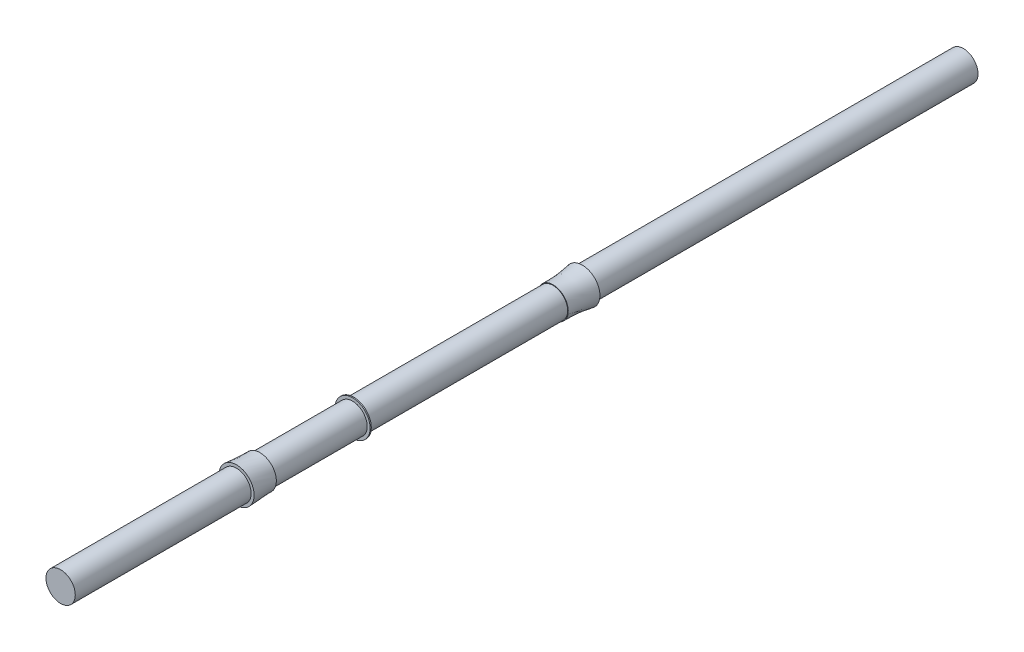
ISO-10303-21;
HEADER;
FILE_DESCRIPTION(('STEP AP214'),'2;1');
FILE_NAME('part.step','',(''),(''),'','','');
FILE_SCHEMA(('AUTOMOTIVE_DESIGN { 1 0 10303 214 1 1 1 1 }'));
ENDSEC;
DATA;
#1=APPLICATION_CONTEXT('core data for automotive mechanical design processes');
#2=APPLICATION_PROTOCOL_DEFINITION('international standard','automotive_design',2000,#1);
#3=PRODUCT_CONTEXT('',#1,'mechanical');
#4=PRODUCT('Part','Part','',(#3));
#5=PRODUCT_RELATED_PRODUCT_CATEGORY('part','',(#4));
#6=PRODUCT_DEFINITION_FORMATION('','',#4);
#7=PRODUCT_DEFINITION_CONTEXT('part definition',#1,'design');
#8=PRODUCT_DEFINITION('design','',#6,#7);
#9=PRODUCT_DEFINITION_SHAPE('','',#8);
#10=(LENGTH_UNIT() NAMED_UNIT(*) SI_UNIT(.MILLI.,.METRE.));
#11=(NAMED_UNIT(*) PLANE_ANGLE_UNIT() SI_UNIT($,.RADIAN.));
#12=(NAMED_UNIT(*) SI_UNIT($,.STERADIAN.) SOLID_ANGLE_UNIT());
#13=UNCERTAINTY_MEASURE_WITH_UNIT(LENGTH_MEASURE(1.E-05),#10,'distance_accuracy_value','');
#14=(GEOMETRIC_REPRESENTATION_CONTEXT(3) GLOBAL_UNCERTAINTY_ASSIGNED_CONTEXT((#13)) GLOBAL_UNIT_ASSIGNED_CONTEXT((#10,
#11,#12)) REPRESENTATION_CONTEXT('',''));
#15=CARTESIAN_POINT('',(0.,0.,0.));
#16=DIRECTION('',(0.,0.,1.));
#17=DIRECTION('',(1.,0.,0.));
#18=AXIS2_PLACEMENT_3D('',#15,#16,#17);
#19=CARTESIAN_POINT('',(0.,0.,750.));
#20=DIRECTION('',(0.,0.,-1.));
#21=DIRECTION('',(-1.,0.,0.));
#22=AXIS2_PLACEMENT_3D('',#19,#20,#21);
#23=CYLINDRICAL_SURFACE('',#22,12.5);
#24=CARTESIAN_POINT('',(0.,0.,501.));
#25=DIRECTION('',(0.,0.,1.));
#26=DIRECTION('',(1.,0.,0.));
#27=AXIS2_PLACEMENT_3D('',#24,#25,#26);
#28=CIRCLE('',#27,12.5);
#29=CARTESIAN_POINT('',(12.5,0.,501.));
#30=VERTEX_POINT('',#29);
#31=EDGE_CURVE('E67',#30,#30,#28,.T.);
#32=ORIENTED_EDGE('',*,*,#31,.T.);
#33=EDGE_LOOP('',(#32));
#34=FACE_BOUND('',#33,.T.);
#35=CARTESIAN_POINT('',(0.,0.,580.));
#36=DIRECTION('',(0.,0.,1.));
#37=DIRECTION('',(1.,0.,0.));
#38=AXIS2_PLACEMENT_3D('',#35,#36,#37);
#39=CIRCLE('',#38,12.5);
#40=CARTESIAN_POINT('',(12.5,0.,580.));
#41=VERTEX_POINT('',#40);
#42=EDGE_CURVE('E11',#41,#41,#39,.T.);
#43=ORIENTED_EDGE('',*,*,#42,.F.);
#44=EDGE_LOOP('',(#43));
#45=FACE_BOUND('',#44,.T.);
#46=ADVANCED_FACE('F47',(#34,#45),#23,.T.);
#47=CARTESIAN_POINT('',(0.,0.,501.));
#48=DIRECTION('',(0.,0.,-1.));
#49=DIRECTION('',(-1.,0.,0.));
#50=AXIS2_PLACEMENT_3D('',#47,#48,#49);
#51=CYLINDRICAL_SURFACE('',#50,15.);
#52=CARTESIAN_POINT('',(0.,0.,501.));
#53=DIRECTION('',(0.,0.,1.));
#54=DIRECTION('',(1.,0.,0.));
#55=AXIS2_PLACEMENT_3D('',#52,#53,#54);
#56=CIRCLE('',#55,15.);
#57=CARTESIAN_POINT('',(15.,0.,501.));
#58=VERTEX_POINT('',#57);
#59=EDGE_CURVE('E167',#58,#58,#56,.T.);
#60=ORIENTED_EDGE('',*,*,#59,.F.);
#61=EDGE_LOOP('',(#60));
#62=FACE_BOUND('',#61,.T.);
#63=CARTESIAN_POINT('',(0.,0.,500.));
#64=DIRECTION('',(0.,0.,1.));
#65=DIRECTION('',(1.,0.,0.));
#66=AXIS2_PLACEMENT_3D('',#63,#64,#65);
#67=CIRCLE('',#66,15.);
#68=CARTESIAN_POINT('',(15.,0.,500.));
#69=VERTEX_POINT('',#68);
#70=EDGE_CURVE('E70',#69,#69,#67,.T.);
#71=ORIENTED_EDGE('',*,*,#70,.T.);
#72=EDGE_LOOP('',(#71));
#73=FACE_BOUND('',#72,.T.);
#74=ADVANCED_FACE('F184',(#62,#73),#51,.T.);
#75=CARTESIAN_POINT('',(0.,0.,501.));
#76=DIRECTION('',(0.,0.,1.));
#77=DIRECTION('',(1.,0.,0.));
#78=AXIS2_PLACEMENT_3D('',#75,#76,#77);
#79=PLANE('',#78);
#80=ORIENTED_EDGE('',*,*,#31,.F.);
#81=EDGE_LOOP('',(#80));
#82=FACE_BOUND('',#81,.T.);
#83=ORIENTED_EDGE('',*,*,#59,.T.);
#84=EDGE_LOOP('',(#83));
#85=FACE_BOUND('',#84,.T.);
#86=ADVANCED_FACE('F180',(#82,#85),#79,.T.);
#87=CARTESIAN_POINT('',(0.,0.,500.));
#88=DIRECTION('',(0.,0.,1.));
#89=DIRECTION('',(1.,0.,0.));
#90=AXIS2_PLACEMENT_3D('',#87,#88,#89);
#91=PLANE('',#90);
#92=CARTESIAN_POINT('',(0.,0.,500.));
#93=DIRECTION('',(0.,0.,1.));
#94=DIRECTION('',(1.,0.,0.));
#95=AXIS2_PLACEMENT_3D('',#92,#93,#94);
#96=CIRCLE('',#95,12.5);
#97=CARTESIAN_POINT('',(12.5,0.,500.));
#98=VERTEX_POINT('',#97);
#99=EDGE_CURVE('E58',#98,#98,#96,.T.);
#100=ORIENTED_EDGE('',*,*,#99,.T.);
#101=EDGE_LOOP('',(#100));
#102=FACE_BOUND('',#101,.T.);
#103=ORIENTED_EDGE('',*,*,#70,.F.);
#104=EDGE_LOOP('',(#103));
#105=FACE_BOUND('',#104,.T.);
#106=ADVANCED_FACE('F183',(#102,#105),#91,.F.);
#107=CARTESIAN_POINT('',(0.,0.,330.));
#108=DIRECTION('',(0.,0.,1.));
#109=DIRECTION('',(1.,0.,0.));
#110=AXIS2_PLACEMENT_3D('',#107,#108,#109);
#111=CIRCLE('',#110,12.5);
#112=CARTESIAN_POINT('',(12.5,0.,330.));
#113=VERTEX_POINT('',#112);
#114=EDGE_CURVE('E68',#113,#113,#111,.T.);
#115=ORIENTED_EDGE('',*,*,#114,.T.);
#116=EDGE_LOOP('',(#115));
#117=FACE_BOUND('',#116,.T.);
#118=ORIENTED_EDGE('',*,*,#99,.F.);
#119=EDGE_LOOP('',(#118));
#120=FACE_BOUND('',#119,.T.);
#121=ADVANCED_FACE('F193',(#117,#120),#23,.T.);
#122=CARTESIAN_POINT('',(0.,0.,330.));
#123=DIRECTION('',(0.,0.,1.));
#124=DIRECTION('',(1.,0.,0.));
#125=AXIS2_PLACEMENT_3D('',#122,#123,#124);
#126=PLANE('',#125);
#127=ORIENTED_EDGE('',*,*,#114,.F.);
#128=EDGE_LOOP('',(#127));
#129=FACE_BOUND('',#128,.T.);
#130=CARTESIAN_POINT('',(0.,0.,330.));
#131=DIRECTION('',(0.,0.,1.));
#132=DIRECTION('',(1.,0.,0.));
#133=AXIS2_PLACEMENT_3D('',#130,#131,#132);
#134=CIRCLE('',#133,13.);
#135=CARTESIAN_POINT('',(12.7573285342903,-2.50011373104978,330.));
#136=VERTEX_POINT('',#135);
#137=EDGE_CURVE('E71',#136,#136,#134,.T.);
#138=ORIENTED_EDGE('',*,*,#137,.T.);
#139=EDGE_LOOP('',(#138));
#140=FACE_BOUND('',#139,.T.);
#141=ADVANCED_FACE('F123',(#129,#140),#126,.T.);
#142=CARTESIAN_POINT('',(0.,0.,305.));
#143=DIRECTION('',(0.,0.,1.));
#144=DIRECTION('',(1.,0.,0.));
#145=AXIS2_PLACEMENT_3D('',#142,#143,#144);
#146=PLANE('',#145);
#147=CARTESIAN_POINT('',(0.,0.,305.));
#148=DIRECTION('',(0.,0.,1.));
#149=DIRECTION('',(1.,0.,0.));
#150=AXIS2_PLACEMENT_3D('',#147,#148,#149);
#151=CIRCLE('',#150,12.5);
#152=CARTESIAN_POINT('',(12.5,0.,305.));
#153=VERTEX_POINT('',#152);
#154=EDGE_CURVE('E54',#153,#153,#151,.T.);
#155=ORIENTED_EDGE('',*,*,#154,.T.);
#156=EDGE_LOOP('',(#155));
#157=FACE_BOUND('',#156,.T.);
#158=CARTESIAN_POINT('',(0.,0.,305.));
#159=DIRECTION('',(0.,0.,1.));
#160=DIRECTION('',(1.,0.,0.));
#161=AXIS2_PLACEMENT_3D('',#158,#159,#160);
#162=CIRCLE('',#161,15.);
#163=CARTESIAN_POINT('',(9.81319453403791,-11.3446557037721,305.));
#164=VERTEX_POINT('',#163);
#165=EDGE_CURVE('E79',#164,#164,#162,.T.);
#166=ORIENTED_EDGE('',*,*,#165,.F.);
#167=EDGE_LOOP('',(#166));
#168=FACE_BOUND('',#167,.T.);
#169=ADVANCED_FACE('F120',(#157,#168),#146,.F.);
#170=CARTESIAN_POINT('',(9.81319453403791,-11.3446557037721,305.));
#171=CARTESIAN_POINT('',(12.7573285342903,-2.50011373104978,330.));
#172=CARTESIAN_POINT('',(32.5025059415821,8.28173336430375,305.));
#173=CARTESIAN_POINT('',(17.7575559963898,23.0145433375307,330.));
#174=CARTESIAN_POINT('',(12.8761168735062,30.9710447718479,305.));
#175=CARTESIAN_POINT('',(-7.7571010721907,28.0147707996303,330.));
#176=CARTESIAN_POINT('',(-9.81319453403792,11.3446557037721,305.));
#177=CARTESIAN_POINT('',(-12.7573285342903,2.50011373104978,330.));
#178=CARTESIAN_POINT('',(-32.5025059415821,-8.28173336430375,305.));
#179=CARTESIAN_POINT('',(-17.7575559963898,-23.0145433375307,330.));
#180=CARTESIAN_POINT('',(-12.8761168735062,-30.9710447718479,305.));
#181=CARTESIAN_POINT('',(7.7571010721907,-28.0147707996303,330.));
#182=CARTESIAN_POINT('',(9.81319453403791,-11.3446557037721,305.));
#183=CARTESIAN_POINT('',(12.7573285342903,-2.50011373104978,330.));
#184=(BOUNDED_SURFACE() B_SPLINE_SURFACE(3,1,((#170,#171),(#172,#173),(#174,#175),(#176,#177),
(#178,#179),(#180,#181),(#182,#183)),.UNSPECIFIED.,.T.,.F.,.F.) B_SPLINE_SURFACE_WITH_KNOTS((4,
3,4),(2,2),(0.,0.5,1.),(0.,1.),
.UNSPECIFIED.) GEOMETRIC_REPRESENTATION_ITEM() RATIONAL_B_SPLINE_SURFACE(((1.,1.),
(0.333333333333333,0.333333333333333),(0.333333333333333,0.333333333333333),(1.,1.),
(0.333333333333333,0.333333333333333),(0.333333333333333,0.333333333333333),(1.,1.))) REPRESENTATION_ITEM('') SURFACE());
#185=CARTESIAN_POINT('',(9.81319453403791,-11.3446557037721,305.));
#186=CARTESIAN_POINT('',(9.84386259654054,-11.2525250582229,305.260416666667));
#187=CARTESIAN_POINT('',(9.87453065904317,-11.1603944126737,305.520833333333));
#188=CARTESIAN_POINT('',(9.93586678404843,-10.9761331215753,306.041666666667));
#189=CARTESIAN_POINT('',(9.96653484655106,-10.8840024760261,306.302083333333));
#190=CARTESIAN_POINT('',(10.0278709715563,-10.6997411849277,306.822916666667));
#191=CARTESIAN_POINT('',(10.0585390340589,-10.6076105393786,307.083333333333));
#192=CARTESIAN_POINT('',(10.1198751590642,-10.4233492482802,307.604166666667));
#193=CARTESIAN_POINT('',(10.1505432215668,-10.331218602731,307.864583333333));
#194=CARTESIAN_POINT('',(10.2118793465721,-10.1469573116326,308.385416666667));
#195=CARTESIAN_POINT('',(10.2425474090747,-10.0548266660834,308.645833333333));
#196=CARTESIAN_POINT('',(10.30388353408,-9.87056537498503,309.166666666667));
#197=CARTESIAN_POINT('',(10.3345515965826,-9.77843472943584,309.427083333333));
#198=CARTESIAN_POINT('',(10.3958877215879,-9.59417343833746,309.947916666667));
#199=CARTESIAN_POINT('',(10.4265557840905,-9.50204279278827,310.208333333333));
#200=CARTESIAN_POINT('',(10.4878919090957,-9.31778150168989,310.729166666667));
#201=CARTESIAN_POINT('',(10.5185599715984,-9.2256508561407,310.989583333333));
#202=CARTESIAN_POINT('',(10.5798960966036,-9.04138956504232,311.510416666667));
#203=CARTESIAN_POINT('',(10.6105641591063,-8.94925891949312,311.770833333333));
#204=CARTESIAN_POINT('',(10.6719002841115,-8.76499762839474,312.291666666667));
#205=CARTESIAN_POINT('',(10.7025683466141,-8.67286698284555,312.552083333333));
#206=CARTESIAN_POINT('',(10.7639044716194,-8.48860569174717,313.072916666667));
#207=CARTESIAN_POINT('',(10.794572534122,-8.39647504619798,313.333333333333));
#208=CARTESIAN_POINT('',(10.8559086591273,-8.2122137550996,313.854166666667));
#209=CARTESIAN_POINT('',(10.8865767216299,-8.1200831095504,314.114583333333));
#210=CARTESIAN_POINT('',(10.9479128466352,-7.93582181845202,314.635416666667));
#211=CARTESIAN_POINT('',(10.9785809091378,-7.84369117290284,314.895833333333));
#212=CARTESIAN_POINT('',(11.0399170341431,-7.65942988180446,315.416666666667));
#213=CARTESIAN_POINT('',(11.0705850966457,-7.56729923625526,315.677083333333));
#214=CARTESIAN_POINT('',(11.1319212216509,-7.38303794515688,316.197916666667));
#215=CARTESIAN_POINT('',(11.1625892841536,-7.29090729960769,316.458333333333));
#216=CARTESIAN_POINT('',(11.2239254091588,-7.10664600850931,316.979166666667));
#217=CARTESIAN_POINT('',(11.2545934716615,-7.01451536296012,317.239583333333));
#218=CARTESIAN_POINT('',(11.3159295966667,-6.83025407186174,317.760416666667));
#219=CARTESIAN_POINT('',(11.3465976591693,-6.73812342631255,318.020833333333));
#220=CARTESIAN_POINT('',(11.4079337841746,-6.55386213521417,318.541666666667));
#221=CARTESIAN_POINT('',(11.4386018466772,-6.46173148966498,318.802083333333));
#222=CARTESIAN_POINT('',(11.4999379716825,-6.2774701985666,319.322916666667));
#223=CARTESIAN_POINT('',(11.5306060341851,-6.1853395530174,319.583333333333));
#224=CARTESIAN_POINT('',(11.5919421591904,-6.00107826191902,320.104166666667));
#225=CARTESIAN_POINT('',(11.622610221693,-5.90894761636984,320.364583333333));
#226=CARTESIAN_POINT('',(11.6839463466983,-5.72468632527146,320.885416666667));
#227=CARTESIAN_POINT('',(11.7146144092009,-5.63255567972226,321.145833333333));
#228=CARTESIAN_POINT('',(11.7759505342061,-5.44829438862388,321.666666666667));
#229=CARTESIAN_POINT('',(11.8066185967088,-5.35616374307469,321.927083333333));
#230=CARTESIAN_POINT('',(11.867954721714,-5.17190245197631,322.447916666667));
#231=CARTESIAN_POINT('',(11.8986227842167,-5.07977180642712,322.708333333333));
#232=CARTESIAN_POINT('',(11.9599589092219,-4.89551051532874,323.229166666667));
#233=CARTESIAN_POINT('',(11.9906269717245,-4.80337986977954,323.489583333333));
#234=CARTESIAN_POINT('',(12.0519630967298,-4.61911857868116,324.010416666667));
#235=CARTESIAN_POINT('',(12.0826311592324,-4.52698793313197,324.270833333333));
#236=CARTESIAN_POINT('',(12.1439672842377,-4.34272664203359,324.791666666667));
#237=CARTESIAN_POINT('',(12.1746353467403,-4.2505959964844,325.052083333333));
#238=CARTESIAN_POINT('',(12.2359714717456,-4.06633470538602,325.572916666667));
#239=CARTESIAN_POINT('',(12.2666395342482,-3.97420405983683,325.833333333333));
#240=CARTESIAN_POINT('',(12.3279756592535,-3.78994276873845,326.354166666667));
#241=CARTESIAN_POINT('',(12.3586437217561,-3.69781212318926,326.614583333333));
#242=CARTESIAN_POINT('',(12.4199798467613,-3.51355083209088,327.135416666667));
#243=CARTESIAN_POINT('',(12.450647909264,-3.42142018654168,327.395833333333));
#244=CARTESIAN_POINT('',(12.5119840342692,-3.2371588954433,327.916666666667));
#245=CARTESIAN_POINT('',(12.5426520967719,-3.14502824989411,328.177083333333));
#246=CARTESIAN_POINT('',(12.6039882217771,-2.96076695879573,328.697916666667));
#247=CARTESIAN_POINT('',(12.6346562842797,-2.86863631324654,328.958333333333));
#248=CARTESIAN_POINT('',(12.695992409285,-2.68437502214816,329.479166666667));
#249=CARTESIAN_POINT('',(12.7266604717876,-2.59224437659897,329.739583333333));
#250=CARTESIAN_POINT('',(12.7573285342903,-2.50011373104978,330.));
#251=B_SPLINE_CURVE_WITH_KNOTS('',3,(#185,#186,#187,#188,#189,#190,#191,#192,#193,#194,#195,
#196,#197,#198,#199,#200,#201,#202,#203,#204,#205,#206,#207,#208,#209,#210,#211,#212,#213,#214,
#215,#216,#217,#218,#219,#220,#221,#222,#223,#224,#225,#226,#227,#228,#229,#230,#231,#232,#233,
#234,#235,#236,#237,#238,#239,#240,#241,#242,#243,#244,#245,#246,#247,#248,#249,#250),
.UNSPECIFIED.,.F.,.F.,(4,2,2,2,2,2,2,2,2,2,2,2,2,2,2,2,2,2,2,2,2,2,2,2,2,2,2,2,2,2,2,2,4),(0.,
0.833791841926268,1.66758368385254,2.5013755257788,3.33516736770502,4.16895920963129,
5.00275105155756,5.83654289348383,6.67033473541009,7.50412657733631,8.33791841926258,
9.17171026118885,10.0055021031151,10.8392939450414,11.6730857869676,12.5068776288939,
13.3406694708201,14.1744613127464,15.0082531546727,15.8420449965989,16.6758368385252,
17.5096286804514,18.3434205223777,19.177212364304,20.0110042062302,20.8447960481565,
21.6785878900827,22.512379732009,23.3461715739353,24.1799634158615,25.0137552577877,
25.847547099714,26.6813389416403),.UNSPECIFIED.);
#252=EDGE_CURVE('BSEAM107',#164,#136,#251,.T.);
#253=ORIENTED_EDGE('',*,*,#165,.T.);
#254=ORIENTED_EDGE('',*,*,#137,.F.);
#255=ORIENTED_EDGE('',*,*,#252,.T.);
#256=ORIENTED_EDGE('',*,*,#252,.F.);
#257=EDGE_LOOP('',(#253,#255,#254,#256));
#258=FACE_BOUND('',#257,.T.);
#259=ADVANCED_FACE('F107',(#258),#184,.T.);
#260=ORIENTED_EDGE('',*,*,#154,.F.);
#261=EDGE_LOOP('',(#260));
#262=FACE_BOUND('',#261,.T.);
#263=CARTESIAN_POINT('',(0.,0.,-20.));
#264=DIRECTION('',(0.,0.,-1.));
#265=DIRECTION('',(-1.,0.,0.));
#266=AXIS2_PLACEMENT_3D('',#263,#264,#265);
#267=CIRCLE('',#266,12.5);
#268=CARTESIAN_POINT('',(-12.5,0.,-20.));
#269=VERTEX_POINT('',#268);
#270=EDGE_CURVE('E74',#269,#269,#267,.T.);
#271=ORIENTED_EDGE('',*,*,#270,.F.);
#272=EDGE_LOOP('',(#271));
#273=FACE_BOUND('',#272,.T.);
#274=ADVANCED_FACE('F119',(#262,#273),#23,.T.);
#275=CARTESIAN_POINT('',(0.,0.,-20.));
#276=DIRECTION('',(0.,0.,-1.));
#277=DIRECTION('',(-1.,0.,0.));
#278=AXIS2_PLACEMENT_3D('',#275,#276,#277);
#279=PLANE('',#278);
#280=ORIENTED_EDGE('',*,*,#270,.T.);
#281=EDGE_LOOP('',(#280));
#282=FACE_BOUND('',#281,.T.);
#283=ADVANCED_FACE('F206',(#282),#279,.T.);
#284=CARTESIAN_POINT('',(0.,0.,580.));
#285=DIRECTION('',(0.,0.,1.));
#286=DIRECTION('',(1.,0.,0.));
#287=AXIS2_PLACEMENT_3D('',#284,#285,#286);
#288=PLANE('',#287);
#289=ORIENTED_EDGE('',*,*,#42,.T.);
#290=EDGE_LOOP('',(#289));
#291=FACE_BOUND('',#290,.T.);
#292=CARTESIAN_POINT('',(0.,0.,580.));
#293=DIRECTION('',(0.,0.,1.));
#294=DIRECTION('',(1.,0.,0.));
#295=AXIS2_PLACEMENT_3D('',#292,#293,#294);
#296=CIRCLE('',#295,14.);
#297=CARTESIAN_POINT('',(8.73966023207673,-10.9370169163194,580.));
#298=VERTEX_POINT('',#297);
#299=EDGE_CURVE('E75',#298,#298,#296,.T.);
#300=ORIENTED_EDGE('',*,*,#299,.F.);
#301=EDGE_LOOP('',(#300));
#302=FACE_BOUND('',#301,.T.);
#303=ADVANCED_FACE('F224',(#291,#302),#288,.F.);
#304=CARTESIAN_POINT('',(0.,0.,600.));
#305=DIRECTION('',(0.,0.,1.));
#306=DIRECTION('',(1.,0.,0.));
#307=AXIS2_PLACEMENT_3D('',#304,#305,#306);
#308=PLANE('',#307);
#309=CARTESIAN_POINT('',(0.,0.,600.));
#310=DIRECTION('',(0.,0.,1.));
#311=DIRECTION('',(1.,0.,0.));
#312=AXIS2_PLACEMENT_3D('',#309,#310,#311);
#313=CIRCLE('',#312,12.5);
#314=CARTESIAN_POINT('',(12.5,0.,600.));
#315=VERTEX_POINT('',#314);
#316=EDGE_CURVE('E72',#315,#315,#313,.T.);
#317=ORIENTED_EDGE('',*,*,#316,.F.);
#318=EDGE_LOOP('',(#317));
#319=FACE_BOUND('',#318,.T.);
#320=CARTESIAN_POINT('',(0.,0.,600.));
#321=DIRECTION('',(0.,0.,1.));
#322=DIRECTION('',(1.,0.,0.));
#323=AXIS2_PLACEMENT_3D('',#320,#321,#322);
#324=CIRCLE('',#323,14.9981293892096);
#325=CARTESIAN_POINT('',(12.8612957442886,-7.71563069057969,600.));
#326=VERTEX_POINT('',#325);
#327=EDGE_CURVE('E82',#326,#326,#324,.T.);
#328=ORIENTED_EDGE('',*,*,#327,.T.);
#329=EDGE_LOOP('',(#328));
#330=FACE_BOUND('',#329,.T.);
#331=ADVANCED_FACE('F218',(#319,#330),#308,.T.);
#332=CARTESIAN_POINT('',(12.8612957442886,-7.71563069057969,600.));
#333=CARTESIAN_POINT('',(8.73966023207673,-10.9370169163194,580.));
#334=CARTESIAN_POINT('',(-2.56996563687075,-33.438222179157,600.));
#335=CARTESIAN_POINT('',(-13.134373600562,-28.4163373804729,580.));
#336=CARTESIAN_POINT('',(-28.292557125448,-18.0069607979976,600.));
#337=CARTESIAN_POINT('',(-30.6136940647155,-6.54230354783408,580.));
#338=CARTESIAN_POINT('',(-12.8612957442886,7.71563069057969,600.));
#339=CARTESIAN_POINT('',(-8.73966023207673,10.9370169163194,580.));
#340=CARTESIAN_POINT('',(2.56996563687074,33.438222179157,600.));
#341=CARTESIAN_POINT('',(13.134373600562,28.4163373804729,580.));
#342=CARTESIAN_POINT('',(28.292557125448,18.0069607979976,600.));
#343=CARTESIAN_POINT('',(30.6136940647155,6.54230354783408,580.));
#344=CARTESIAN_POINT('',(12.8612957442886,-7.71563069057969,600.));
#345=CARTESIAN_POINT('',(8.73966023207673,-10.9370169163194,580.));
#346=(BOUNDED_SURFACE() B_SPLINE_SURFACE(3,1,((#332,#333),(#334,#335),(#336,#337),(#338,#339),
(#340,#341),(#342,#343),(#344,#345)),.UNSPECIFIED.,.T.,.F.,.F.) B_SPLINE_SURFACE_WITH_KNOTS((4,
3,4),(2,2),(0.,0.5,1.),(0.,1.),
.UNSPECIFIED.) GEOMETRIC_REPRESENTATION_ITEM() RATIONAL_B_SPLINE_SURFACE(((1.,1.),
(0.333333333333333,0.333333333333333),(0.333333333333333,0.333333333333333),(1.,1.),
(0.333333333333333,0.333333333333333),(0.333333333333333,0.333333333333333),(1.,1.))) REPRESENTATION_ITEM('') SURFACE());
#347=CARTESIAN_POINT('',(12.8612957442886,-7.71563069057969,600.));
#348=CARTESIAN_POINT('',(12.8183620410364,-7.7491867970978,599.791666666667));
#349=CARTESIAN_POINT('',(12.7754283377842,-7.78274290361592,599.583333333333));
#350=CARTESIAN_POINT('',(12.6895609312798,-7.84985511665218,599.166666666667));
#351=CARTESIAN_POINT('',(12.6466272280276,-7.88341122317031,598.958333333333));
#352=CARTESIAN_POINT('',(12.5607598215232,-7.95052343620655,598.541666666667));
#353=CARTESIAN_POINT('',(12.517826118271,-7.98407954272466,598.333333333333));
#354=CARTESIAN_POINT('',(12.4319587117666,-8.0511917557609,597.916666666667));
#355=CARTESIAN_POINT('',(12.3890250085143,-8.08474786227903,597.708333333333));
#356=CARTESIAN_POINT('',(12.3031576020099,-8.15186007531528,597.291666666667));
#357=CARTESIAN_POINT('',(12.2602238987577,-8.1854161818334,597.083333333333));
#358=CARTESIAN_POINT('',(12.1743564922533,-8.25252839486964,596.666666666667));
#359=CARTESIAN_POINT('',(12.1314227890011,-8.28608450138776,596.458333333333));
#360=CARTESIAN_POINT('',(12.0455553824967,-8.35319671442401,596.041666666667));
#361=CARTESIAN_POINT('',(12.0026216792445,-8.38675282094213,595.833333333333));
#362=CARTESIAN_POINT('',(11.9167542727401,-8.45386503397837,595.416666666667));
#363=CARTESIAN_POINT('',(11.8738205694879,-8.48742114049649,595.208333333333));
#364=CARTESIAN_POINT('',(11.7879531629835,-8.55453335353273,594.791666666667));
#365=CARTESIAN_POINT('',(11.7450194597312,-8.58808946005086,594.583333333333));
#366=CARTESIAN_POINT('',(11.6591520532268,-8.6552016730871,594.166666666667));
#367=CARTESIAN_POINT('',(11.6162183499746,-8.68875777960522,593.958333333333));
#368=CARTESIAN_POINT('',(11.5303509434702,-8.75586999264147,593.541666666667));
#369=CARTESIAN_POINT('',(11.487417240218,-8.78942609915959,593.333333333333));
#370=CARTESIAN_POINT('',(11.4015498337136,-8.85653831219583,592.916666666667));
#371=CARTESIAN_POINT('',(11.3586161304614,-8.89009441871396,592.708333333333));
#372=CARTESIAN_POINT('',(11.272748723957,-8.9572066317502,592.291666666667));
#373=CARTESIAN_POINT('',(11.2298150207048,-8.99076273826832,592.083333333333));
#374=CARTESIAN_POINT('',(11.1439476142003,-9.05787495130456,591.666666666667));
#375=CARTESIAN_POINT('',(11.1010139109481,-9.09143105782269,591.458333333333));
#376=CARTESIAN_POINT('',(11.0151465044437,-9.15854327085893,591.041666666667));
#377=CARTESIAN_POINT('',(10.9722128011915,-9.19209937737705,590.833333333333));
#378=CARTESIAN_POINT('',(10.8863453946871,-9.25921159041329,590.416666666667));
#379=CARTESIAN_POINT('',(10.8434116914349,-9.29276769693142,590.208333333333));
#380=CARTESIAN_POINT('',(10.7575442849305,-9.35987990996766,589.791666666667));
#381=CARTESIAN_POINT('',(10.7146105816783,-9.39343601648578,589.583333333333));
#382=CARTESIAN_POINT('',(10.6287431751739,-9.46054822952203,589.166666666667));
#383=CARTESIAN_POINT('',(10.5858094719216,-9.49410433604015,588.958333333333));
#384=CARTESIAN_POINT('',(10.4999420654172,-9.56121654907639,588.541666666667));
#385=CARTESIAN_POINT('',(10.457008362165,-9.59477265559452,588.333333333333));
#386=CARTESIAN_POINT('',(10.3711409556606,-9.66188486863076,587.916666666667));
#387=CARTESIAN_POINT('',(10.3282072524084,-9.69544097514887,587.708333333333));
#388=CARTESIAN_POINT('',(10.242339845904,-9.76255318818512,587.291666666667));
#389=CARTESIAN_POINT('',(10.1994061426518,-9.79610929470325,587.083333333333));
#390=CARTESIAN_POINT('',(10.1135387361474,-9.86322150773949,586.666666666667));
#391=CARTESIAN_POINT('',(10.0706050328952,-9.89677761425761,586.458333333333));
#392=CARTESIAN_POINT('',(9.98473762639075,-9.96388982729385,586.041666666667));
#393=CARTESIAN_POINT('',(9.94180392313854,-9.99744593381197,585.833333333333));
#394=CARTESIAN_POINT('',(9.85593651663412,-10.0645581468482,585.416666666667));
#395=CARTESIAN_POINT('',(9.81300281338192,-10.0981142533663,585.208333333333));
#396=CARTESIAN_POINT('',(9.7271354068775,-10.1652264664026,584.791666666667));
#397=CARTESIAN_POINT('',(9.6842017036253,-10.1987825729207,584.583333333333));
#398=CARTESIAN_POINT('',(9.59833429712088,-10.265894785957,584.166666666667));
#399=CARTESIAN_POINT('',(9.55540059386867,-10.2994508924751,583.958333333333));
#400=CARTESIAN_POINT('',(9.46953318736425,-10.3665631055113,583.541666666667));
#401=CARTESIAN_POINT('',(9.42659948411205,-10.4001192120294,583.333333333333));
#402=CARTESIAN_POINT('',(9.34073207760764,-10.4672314250657,582.916666666667));
#403=CARTESIAN_POINT('',(9.29779837435544,-10.5007875315838,582.708333333333));
#404=CARTESIAN_POINT('',(9.21193096785101,-10.56789974462,582.291666666667));
#405=CARTESIAN_POINT('',(9.1689972645988,-10.6014558511382,582.083333333333));
#406=CARTESIAN_POINT('',(9.08312985809439,-10.6685680641744,581.666666666667));
#407=CARTESIAN_POINT('',(9.04019615484219,-10.7021241706925,581.458333333333));
#408=CARTESIAN_POINT('',(8.95432874833778,-10.7692363837288,581.041666666667));
#409=CARTESIAN_POINT('',(8.91139504508556,-10.8027924902469,580.833333333333));
#410=CARTESIAN_POINT('',(8.82552763858113,-10.8699047032832,580.416666666667));
#411=CARTESIAN_POINT('',(8.78259393532892,-10.9034608098013,580.208333333333));
#412=CARTESIAN_POINT('',(8.73966023207673,-10.9370169163194,580.));
#413=B_SPLINE_CURVE_WITH_KNOTS('',3,(#347,#348,#349,#350,#351,#352,#353,#354,#355,#356,#357,
#358,#359,#360,#361,#362,#363,#364,#365,#366,#367,#368,#369,#370,#371,#372,#373,#374,#375,#376,
#377,#378,#379,#380,#381,#382,#383,#384,#385,#386,#387,#388,#389,#390,#391,#392,#393,#394,#395,
#396,#397,#398,#399,#400,#401,#402,#403,#404,#405,#406,#407,#408,#409,#410,#411,#412),
.UNSPECIFIED.,.F.,.F.,(4,2,2,2,2,2,2,2,2,2,2,2,2,2,2,2,2,2,2,2,2,2,2,2,2,2,2,2,2,2,2,2,4),(0.,
0.646025414698647,1.29205082939708,1.93807624409573,2.58410165879416,3.23012707349281,
3.87615248819135,4.52217790288989,5.16820331758843,5.81422873228697,6.46025414698551,
7.10627956168405,7.75230497638259,8.39833039108123,9.04435580577977,9.69038122047831,
10.3364066351769,10.9824320498754,11.6284574645739,12.2744828792725,12.9205082939711,
13.5665337086696,14.2125591233682,14.8585845380667,15.5046099527653,16.1506353674638,
16.7966607821624,17.442686196861,18.0887116115596,18.734737026258,19.3807624409566,
20.0267878556551,20.6728132703537),.UNSPECIFIED.);
#414=EDGE_CURVE('BSEAM214',#326,#298,#413,.T.);
#415=ORIENTED_EDGE('',*,*,#327,.F.);
#416=ORIENTED_EDGE('',*,*,#299,.T.);
#417=ORIENTED_EDGE('',*,*,#414,.T.);
#418=ORIENTED_EDGE('',*,*,#414,.F.);
#419=EDGE_LOOP('',(#415,#417,#416,#418));
#420=FACE_BOUND('',#419,.T.);
#421=ADVANCED_FACE('F214',(#420),#346,.T.);
#422=CARTESIAN_POINT('',(0.,0.,750.));
#423=DIRECTION('',(0.,0.,1.));
#424=DIRECTION('',(1.,0.,0.));
#425=AXIS2_PLACEMENT_3D('',#422,#423,#424);
#426=PLANE('',#425);
#427=CARTESIAN_POINT('',(0.,0.,750.));
#428=DIRECTION('',(0.,0.,1.));
#429=DIRECTION('',(1.,0.,0.));
#430=AXIS2_PLACEMENT_3D('',#427,#428,#429);
#431=CIRCLE('',#430,12.5);
#432=CARTESIAN_POINT('',(12.5,0.,750.));
#433=VERTEX_POINT('',#432);
#434=EDGE_CURVE('E63',#433,#433,#431,.T.);
#435=ORIENTED_EDGE('',*,*,#434,.T.);
#436=EDGE_LOOP('',(#435));
#437=FACE_BOUND('',#436,.T.);
#438=ADVANCED_FACE('F209',(#437),#426,.T.);
#439=ORIENTED_EDGE('',*,*,#316,.T.);
#440=EDGE_LOOP('',(#439));
#441=FACE_BOUND('',#440,.T.);
#442=ORIENTED_EDGE('',*,*,#434,.F.);
#443=EDGE_LOOP('',(#442));
#444=FACE_BOUND('',#443,.T.);
#445=ADVANCED_FACE('F49',(#441,#444),#23,.T.);
#446=CLOSED_SHELL('',(#46,#74,#86,#106,#121,#141,#169,#259,#274,#283,#303,#331,#421,#438,#445));
#447=MANIFOLD_SOLID_BREP('B2',#446);
#448=ADVANCED_BREP_SHAPE_REPRESENTATION('',(#18,#447),#14);
#449=SHAPE_DEFINITION_REPRESENTATION(#9,#448);
ENDSEC;
END-ISO-10303-21;
